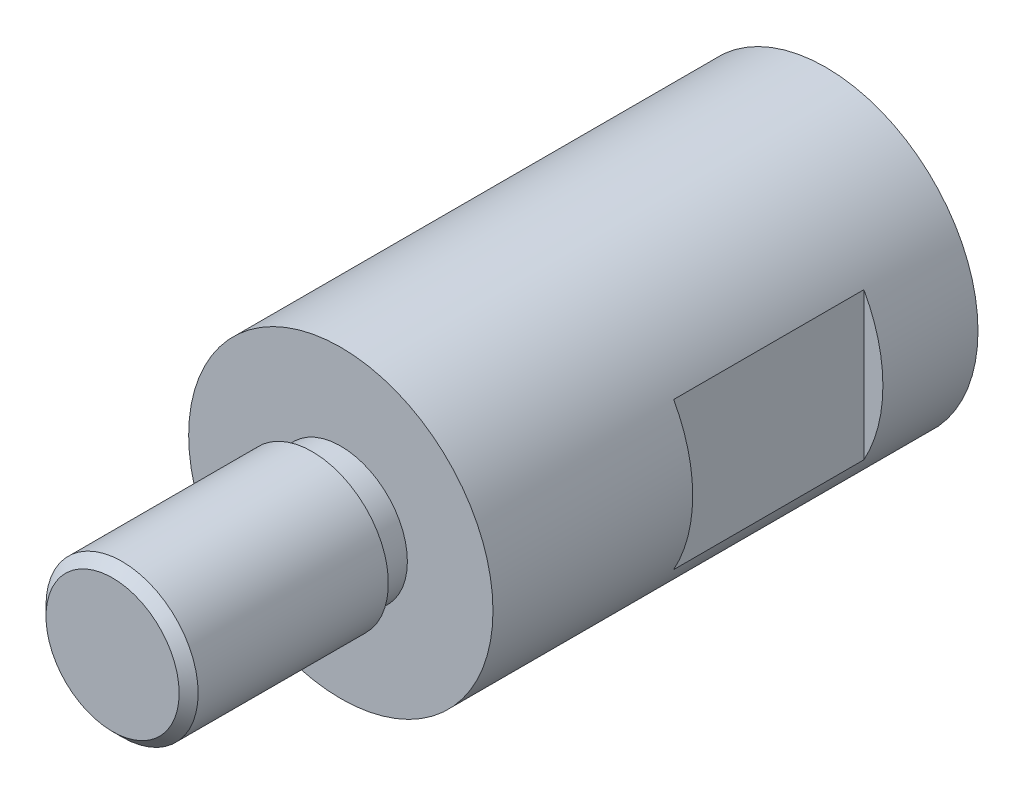
ISO-10303-21;
HEADER;
FILE_DESCRIPTION(('STEP AP214'),'2;1');
FILE_NAME('part.step','',(''),(''),'','','');
FILE_SCHEMA(('AUTOMOTIVE_DESIGN { 1 0 10303 214 1 1 1 1 }'));
ENDSEC;
DATA;
#1=APPLICATION_CONTEXT('core data for automotive mechanical design processes');
#2=APPLICATION_PROTOCOL_DEFINITION('international standard','automotive_design',2000,#1);
#3=PRODUCT_CONTEXT('',#1,'mechanical');
#4=PRODUCT('Part','Part','',(#3));
#5=PRODUCT_RELATED_PRODUCT_CATEGORY('part','',(#4));
#6=PRODUCT_DEFINITION_FORMATION('','',#4);
#7=PRODUCT_DEFINITION_CONTEXT('part definition',#1,'design');
#8=PRODUCT_DEFINITION('design','',#6,#7);
#9=PRODUCT_DEFINITION_SHAPE('','',#8);
#10=(LENGTH_UNIT() NAMED_UNIT(*) SI_UNIT(.MILLI.,.METRE.));
#11=(NAMED_UNIT(*) PLANE_ANGLE_UNIT() SI_UNIT($,.RADIAN.));
#12=(NAMED_UNIT(*) SI_UNIT($,.STERADIAN.) SOLID_ANGLE_UNIT());
#13=UNCERTAINTY_MEASURE_WITH_UNIT(LENGTH_MEASURE(1.E-05),#10,'distance_accuracy_value','');
#14=(GEOMETRIC_REPRESENTATION_CONTEXT(3) GLOBAL_UNCERTAINTY_ASSIGNED_CONTEXT((#13)) GLOBAL_UNIT_ASSIGNED_CONTEXT((#10,
#11,#12)) REPRESENTATION_CONTEXT('',''));
#15=CARTESIAN_POINT('',(0.,0.,0.));
#16=DIRECTION('',(0.,0.,1.));
#17=DIRECTION('',(1.,0.,0.));
#18=AXIS2_PLACEMENT_3D('',#15,#16,#17);
#19=CARTESIAN_POINT('',(0.,0.,25.5));
#20=DIRECTION('',(0.,0.,1.));
#21=DIRECTION('',(1.,0.,0.));
#22=AXIS2_PLACEMENT_3D('',#19,#20,#21);
#23=PLANE('',#22);
#24=CARTESIAN_POINT('',(0.,0.,25.5));
#25=DIRECTION('',(0.,0.,1.));
#26=DIRECTION('',(1.,0.,0.));
#27=AXIS2_PLACEMENT_3D('',#24,#25,#26);
#28=CIRCLE('',#27,3.5);
#29=CARTESIAN_POINT('',(3.5,0.,25.5));
#30=VERTEX_POINT('',#29);
#31=EDGE_CURVE('E185',#30,#30,#28,.T.);
#32=ORIENTED_EDGE('',*,*,#31,.F.);
#33=EDGE_LOOP('',(#32));
#34=FACE_BOUND('',#33,.T.);
#35=CARTESIAN_POINT('',(0.,0.,25.5));
#36=DIRECTION('',(0.,0.,1.));
#37=DIRECTION('',(1.,0.,0.));
#38=AXIS2_PLACEMENT_3D('',#35,#36,#37);
#39=CIRCLE('',#38,8.);
#40=CARTESIAN_POINT('',(8.,0.,25.5));
#41=VERTEX_POINT('',#40);
#42=EDGE_CURVE('E103',#41,#41,#39,.T.);
#43=ORIENTED_EDGE('',*,*,#42,.T.);
#44=EDGE_LOOP('',(#43));
#45=FACE_BOUND('',#44,.T.);
#46=ADVANCED_FACE('F34',(#34,#45),#23,.T.);
#47=CARTESIAN_POINT('',(0.,0.,25.5));
#48=DIRECTION('',(0.,0.,-1.));
#49=DIRECTION('',(-1.,0.,0.));
#50=AXIS2_PLACEMENT_3D('',#47,#48,#49);
#51=CYLINDRICAL_SURFACE('',#50,8.);
#52=CARTESIAN_POINT('',(0.,0.,15.));
#53=DIRECTION('',(0.,0.,1.));
#54=DIRECTION('',(1.,0.,0.));
#55=AXIS2_PLACEMENT_3D('',#52,#53,#54);
#56=CIRCLE('',#55,8.);
#57=CARTESIAN_POINT('',(7.,-3.87298334620741,15.));
#58=VERTEX_POINT('',#57);
#59=CARTESIAN_POINT('',(7.,3.87298334620741,15.));
#60=VERTEX_POINT('',#59);
#61=EDGE_CURVE('E128',#58,#60,#56,.T.);
#62=ORIENTED_EDGE('',*,*,#61,.T.);
#63=DIRECTION('',(0.,0.,-1.));
#64=VECTOR('',#63,1.);
#65=CARTESIAN_POINT('',(7.,3.87298334620741,25.5));
#66=LINE('',#65,#64);
#67=CARTESIAN_POINT('',(7.,3.87298334620742,5.));
#68=VERTEX_POINT('',#67);
#69=EDGE_CURVE('E125',#60,#68,#66,.T.);
#70=ORIENTED_EDGE('',*,*,#69,.T.);
#71=CARTESIAN_POINT('',(0.,0.,4.99999999999999));
#72=DIRECTION('',(0.,0.,-1.));
#73=DIRECTION('',(-1.,0.,0.));
#74=AXIS2_PLACEMENT_3D('',#71,#72,#73);
#75=CIRCLE('',#74,8.);
#76=CARTESIAN_POINT('',(7.,-3.87298334620742,5.));
#77=VERTEX_POINT('',#76);
#78=EDGE_CURVE('E119',#68,#77,#75,.T.);
#79=ORIENTED_EDGE('',*,*,#78,.T.);
#80=DIRECTION('',(0.,0.,-1.));
#81=VECTOR('',#80,1.);
#82=CARTESIAN_POINT('',(7.,-3.87298334620741,25.5));
#83=LINE('',#82,#81);
#84=EDGE_CURVE('E122',#77,#58,#83,.F.);
#85=ORIENTED_EDGE('',*,*,#84,.T.);
#86=EDGE_LOOP('',(#62,#70,#79,#85));
#87=FACE_BOUND('',#86,.T.);
#88=CARTESIAN_POINT('',(0.,0.,5.));
#89=DIRECTION('',(0.,0.,-1.));
#90=DIRECTION('',(-1.,0.,0.));
#91=AXIS2_PLACEMENT_3D('',#88,#89,#90);
#92=CIRCLE('',#91,8.);
#93=CARTESIAN_POINT('',(-7.,-3.87298334620742,5.));
#94=VERTEX_POINT('',#93);
#95=CARTESIAN_POINT('',(-7.,3.87298334620742,5.));
#96=VERTEX_POINT('',#95);
#97=EDGE_CURVE('E117',#94,#96,#92,.T.);
#98=ORIENTED_EDGE('',*,*,#97,.T.);
#99=DIRECTION('',(0.,0.,-1.));
#100=VECTOR('',#99,1.);
#101=CARTESIAN_POINT('',(-7.,3.87298334620742,25.5));
#102=LINE('',#101,#100);
#103=CARTESIAN_POINT('',(-7.,3.87298334620742,15.));
#104=VERTEX_POINT('',#103);
#105=EDGE_CURVE('E111',#96,#104,#102,.F.);
#106=ORIENTED_EDGE('',*,*,#105,.T.);
#107=CARTESIAN_POINT('',(0.,0.,15.));
#108=DIRECTION('',(0.,0.,1.));
#109=DIRECTION('',(1.,0.,0.));
#110=AXIS2_PLACEMENT_3D('',#107,#108,#109);
#111=CIRCLE('',#110,8.);
#112=CARTESIAN_POINT('',(-7.,-3.87298334620742,15.));
#113=VERTEX_POINT('',#112);
#114=EDGE_CURVE('E106',#104,#113,#111,.T.);
#115=ORIENTED_EDGE('',*,*,#114,.T.);
#116=DIRECTION('',(0.,0.,-1.));
#117=VECTOR('',#116,1.);
#118=CARTESIAN_POINT('',(-7.,-3.87298334620742,25.5));
#119=LINE('',#118,#117);
#120=EDGE_CURVE('E114',#113,#94,#119,.T.);
#121=ORIENTED_EDGE('',*,*,#120,.T.);
#122=EDGE_LOOP('',(#98,#106,#115,#121));
#123=FACE_BOUND('',#122,.T.);
#124=ORIENTED_EDGE('',*,*,#42,.F.);
#125=EDGE_LOOP('',(#124));
#126=FACE_BOUND('',#125,.T.);
#127=CARTESIAN_POINT('',(0.,0.,0.));
#128=DIRECTION('',(0.,0.,1.));
#129=DIRECTION('',(1.,0.,0.));
#130=AXIS2_PLACEMENT_3D('',#127,#128,#129);
#131=CIRCLE('',#130,8.);
#132=CARTESIAN_POINT('',(8.,0.,0.));
#133=VERTEX_POINT('',#132);
#134=EDGE_CURVE('E101',#133,#133,#131,.T.);
#135=ORIENTED_EDGE('',*,*,#134,.T.);
#136=EDGE_LOOP('',(#135));
#137=FACE_BOUND('',#136,.T.);
#138=ADVANCED_FACE('F148',(#87,#123,#126,#137),#51,.T.);
#139=CARTESIAN_POINT('',(0.,0.,0.));
#140=DIRECTION('',(0.,0.,1.));
#141=DIRECTION('',(1.,0.,0.));
#142=AXIS2_PLACEMENT_3D('',#139,#140,#141);
#143=PLANE('',#142);
#144=CARTESIAN_POINT('',(0.,0.,0.));
#145=DIRECTION('',(0.,0.,-1.));
#146=DIRECTION('',(-1.,0.,0.));
#147=AXIS2_PLACEMENT_3D('',#144,#145,#146);
#148=CIRCLE('',#147,4.);
#149=CARTESIAN_POINT('',(-4.,0.,0.));
#150=VERTEX_POINT('',#149);
#151=EDGE_CURVE('E174',#150,#150,#148,.T.);
#152=ORIENTED_EDGE('',*,*,#151,.F.);
#153=EDGE_LOOP('',(#152));
#154=FACE_BOUND('',#153,.T.);
#155=ORIENTED_EDGE('',*,*,#134,.F.);
#156=EDGE_LOOP('',(#155));
#157=FACE_BOUND('',#156,.T.);
#158=ADVANCED_FACE('F154',(#154,#157),#143,.F.);
#159=CARTESIAN_POINT('',(-8.,-9.25,5.));
#160=DIRECTION('',(0.,0.,-1.));
#161=DIRECTION('',(-1.,0.,0.));
#162=AXIS2_PLACEMENT_3D('',#159,#160,#161);
#163=PLANE('',#162);
#164=ORIENTED_EDGE('',*,*,#97,.F.);
#165=DIRECTION('',(0.,1.,0.));
#166=VECTOR('',#165,1.);
#167=CARTESIAN_POINT('',(-7.,-9.25,5.));
#168=LINE('',#167,#166);
#169=EDGE_CURVE('E98',#94,#96,#168,.T.);
#170=ORIENTED_EDGE('',*,*,#169,.T.);
#171=EDGE_LOOP('',(#164,#170));
#172=FACE_BOUND('',#171,.T.);
#173=ADVANCED_FACE('F163',(#172),#163,.F.);
#174=CARTESIAN_POINT('',(-7.,-9.25,5.));
#175=DIRECTION('',(1.,0.,0.));
#176=DIRECTION('',(0.,0.,-1.));
#177=AXIS2_PLACEMENT_3D('',#174,#175,#176);
#178=PLANE('',#177);
#179=DIRECTION('',(0.,1.,0.));
#180=VECTOR('',#179,1.);
#181=CARTESIAN_POINT('',(-7.,-9.25,15.));
#182=LINE('',#181,#180);
#183=EDGE_CURVE('E56',#113,#104,#182,.T.);
#184=ORIENTED_EDGE('',*,*,#183,.T.);
#185=ORIENTED_EDGE('',*,*,#105,.F.);
#186=ORIENTED_EDGE('',*,*,#169,.F.);
#187=ORIENTED_EDGE('',*,*,#120,.F.);
#188=EDGE_LOOP('',(#184,#185,#186,#187));
#189=FACE_BOUND('',#188,.T.);
#190=ADVANCED_FACE('F168',(#189),#178,.F.);
#191=CARTESIAN_POINT('',(-8.,-9.25,15.));
#192=DIRECTION('',(0.,0.,1.));
#193=DIRECTION('',(1.,0.,0.));
#194=AXIS2_PLACEMENT_3D('',#191,#192,#193);
#195=PLANE('',#194);
#196=ORIENTED_EDGE('',*,*,#183,.F.);
#197=ORIENTED_EDGE('',*,*,#114,.F.);
#198=EDGE_LOOP('',(#196,#197));
#199=FACE_BOUND('',#198,.T.);
#200=ADVANCED_FACE('F160',(#199),#195,.F.);
#201=CARTESIAN_POINT('',(8.,-9.25,15.));
#202=DIRECTION('',(0.,0.,1.));
#203=DIRECTION('',(1.,0.,0.));
#204=AXIS2_PLACEMENT_3D('',#201,#202,#203);
#205=PLANE('',#204);
#206=ORIENTED_EDGE('',*,*,#61,.F.);
#207=DIRECTION('',(0.,1.,0.));
#208=VECTOR('',#207,1.);
#209=CARTESIAN_POINT('',(7.,-9.25,15.));
#210=LINE('',#209,#208);
#211=EDGE_CURVE('E89',#58,#60,#210,.T.);
#212=ORIENTED_EDGE('',*,*,#211,.T.);
#213=EDGE_LOOP('',(#206,#212));
#214=FACE_BOUND('',#213,.T.);
#215=ADVANCED_FACE('F212',(#214),#205,.F.);
#216=CARTESIAN_POINT('',(7.,-9.25,5.));
#217=DIRECTION('',(-1.,0.,0.));
#218=DIRECTION('',(0.,0.,1.));
#219=AXIS2_PLACEMENT_3D('',#216,#217,#218);
#220=PLANE('',#219);
#221=ORIENTED_EDGE('',*,*,#211,.F.);
#222=ORIENTED_EDGE('',*,*,#84,.F.);
#223=DIRECTION('',(0.,1.,0.));
#224=VECTOR('',#223,1.);
#225=CARTESIAN_POINT('',(7.,-9.25,5.));
#226=LINE('',#225,#224);
#227=EDGE_CURVE('E49',#77,#68,#226,.T.);
#228=ORIENTED_EDGE('',*,*,#227,.T.);
#229=ORIENTED_EDGE('',*,*,#69,.F.);
#230=EDGE_LOOP('',(#221,#222,#228,#229));
#231=FACE_BOUND('',#230,.T.);
#232=ADVANCED_FACE('F215',(#231),#220,.F.);
#233=CARTESIAN_POINT('',(8.,-9.25,5.));
#234=DIRECTION('',(0.,0.,-1.));
#235=DIRECTION('',(-1.,0.,0.));
#236=AXIS2_PLACEMENT_3D('',#233,#234,#235);
#237=PLANE('',#236);
#238=ORIENTED_EDGE('',*,*,#227,.F.);
#239=ORIENTED_EDGE('',*,*,#78,.F.);
#240=EDGE_LOOP('',(#238,#239));
#241=FACE_BOUND('',#240,.T.);
#242=ADVANCED_FACE('F81',(#241),#237,.F.);
#243=CARTESIAN_POINT('',(0.,0.,19.75));
#244=DIRECTION('',(0.,0.,-1.));
#245=DIRECTION('',(-1.,0.,0.));
#246=AXIS2_PLACEMENT_3D('',#243,#244,#245);
#247=CONICAL_SURFACE('',#246,3.4,1.02974425867665);
#248=CARTESIAN_POINT('',(0.,0.,21.7929261046937));
#249=VERTEX_POINT('',#248);
#250=VERTEX_LOOP('',#249);
#251=FACE_BOUND('',#250,.T.);
#252=CARTESIAN_POINT('',(0.,0.,19.75));
#253=DIRECTION('',(0.,0.,-1.));
#254=DIRECTION('',(-1.,0.,0.));
#255=AXIS2_PLACEMENT_3D('',#252,#253,#254);
#256=CIRCLE('',#255,3.4);
#257=CARTESIAN_POINT('',(-3.4,0.,19.75));
#258=VERTEX_POINT('',#257);
#259=EDGE_CURVE('E85',#258,#258,#256,.T.);
#260=ORIENTED_EDGE('',*,*,#259,.T.);
#261=EDGE_LOOP('',(#260));
#262=FACE_BOUND('',#261,.T.);
#263=ADVANCED_FACE('F77',(#251,#262),#247,.F.);
#264=CARTESIAN_POINT('',(0.,0.,0.));
#265=DIRECTION('',(0.,0.,-1.));
#266=DIRECTION('',(-1.,0.,0.));
#267=AXIS2_PLACEMENT_3D('',#264,#265,#266);
#268=CYLINDRICAL_SURFACE('',#267,3.4);
#269=ORIENTED_EDGE('',*,*,#259,.F.);
#270=EDGE_LOOP('',(#269));
#271=FACE_BOUND('',#270,.T.);
#272=CARTESIAN_POINT('',(0.,0.,16.));
#273=DIRECTION('',(0.,0.,-1.));
#274=DIRECTION('',(-1.,0.,0.));
#275=AXIS2_PLACEMENT_3D('',#272,#273,#274);
#276=CIRCLE('',#275,3.4);
#277=CARTESIAN_POINT('',(-3.4,0.,16.));
#278=VERTEX_POINT('',#277);
#279=EDGE_CURVE('E87',#278,#278,#276,.T.);
#280=ORIENTED_EDGE('',*,*,#279,.T.);
#281=EDGE_LOOP('',(#280));
#282=FACE_BOUND('',#281,.T.);
#283=ADVANCED_FACE('F80',(#271,#282),#268,.F.);
#284=CARTESIAN_POINT('',(3.4,0.,16.));
#285=DIRECTION('',(0.,0.,1.));
#286=DIRECTION('',(1.,0.,0.));
#287=AXIS2_PLACEMENT_3D('',#284,#285,#286);
#288=PLANE('',#287);
#289=ORIENTED_EDGE('',*,*,#279,.F.);
#290=EDGE_LOOP('',(#289));
#291=FACE_BOUND('',#290,.T.);
#292=CARTESIAN_POINT('',(0.,0.,16.));
#293=DIRECTION('',(0.,0.,-1.));
#294=DIRECTION('',(-1.,0.,0.));
#295=AXIS2_PLACEMENT_3D('',#292,#293,#294);
#296=CIRCLE('',#295,4.);
#297=CARTESIAN_POINT('',(-4.,0.,16.));
#298=VERTEX_POINT('',#297);
#299=EDGE_CURVE('E92',#298,#298,#296,.T.);
#300=ORIENTED_EDGE('',*,*,#299,.T.);
#301=EDGE_LOOP('',(#300));
#302=FACE_BOUND('',#301,.T.);
#303=ADVANCED_FACE('F203',(#291,#302),#288,.F.);
#304=CARTESIAN_POINT('',(0.,0.,0.));
#305=DIRECTION('',(0.,0.,-1.));
#306=DIRECTION('',(-1.,0.,0.));
#307=AXIS2_PLACEMENT_3D('',#304,#305,#306);
#308=CYLINDRICAL_SURFACE('',#307,4.);
#309=ORIENTED_EDGE('',*,*,#299,.F.);
#310=EDGE_LOOP('',(#309));
#311=FACE_BOUND('',#310,.T.);
#312=ORIENTED_EDGE('',*,*,#151,.T.);
#313=EDGE_LOOP('',(#312));
#314=FACE_BOUND('',#313,.T.);
#315=ADVANCED_FACE('F196',(#311,#314),#308,.F.);
#316=CARTESIAN_POINT('',(0.,3.5,27.));
#317=DIRECTION('',(0.,0.,-1.));
#318=DIRECTION('',(-1.,0.,0.));
#319=AXIS2_PLACEMENT_3D('',#316,#317,#318);
#320=PLANE('',#319);
#321=CARTESIAN_POINT('',(0.,0.,27.));
#322=DIRECTION('',(0.,0.,1.));
#323=DIRECTION('',(1.,0.,0.));
#324=AXIS2_PLACEMENT_3D('',#321,#322,#323);
#325=CIRCLE('',#324,3.5);
#326=CARTESIAN_POINT('',(3.5,0.,27.));
#327=VERTEX_POINT('',#326);
#328=EDGE_CURVE('E181',#327,#327,#325,.T.);
#329=ORIENTED_EDGE('',*,*,#328,.T.);
#330=EDGE_LOOP('',(#329));
#331=FACE_BOUND('',#330,.T.);
#332=CARTESIAN_POINT('',(0.,0.,27.));
#333=DIRECTION('',(0.,0.,-1.));
#334=DIRECTION('',(-1.,0.,0.));
#335=AXIS2_PLACEMENT_3D('',#332,#333,#334);
#336=CIRCLE('',#335,4.);
#337=CARTESIAN_POINT('',(-4.,0.,27.));
#338=VERTEX_POINT('',#337);
#339=EDGE_CURVE('E38',#338,#338,#336,.T.);
#340=ORIENTED_EDGE('',*,*,#339,.T.);
#341=EDGE_LOOP('',(#340));
#342=FACE_BOUND('',#341,.T.);
#343=ADVANCED_FACE('F190',(#331,#342),#320,.T.);
#344=CARTESIAN_POINT('',(0.,0.,15.));
#345=DIRECTION('',(0.,0.,1.));
#346=DIRECTION('',(1.,0.,0.));
#347=AXIS2_PLACEMENT_3D('',#344,#345,#346);
#348=CYLINDRICAL_SURFACE('',#347,3.5);
#349=ORIENTED_EDGE('',*,*,#31,.T.);
#350=EDGE_LOOP('',(#349));
#351=FACE_BOUND('',#350,.T.);
#352=ORIENTED_EDGE('',*,*,#328,.F.);
#353=EDGE_LOOP('',(#352));
#354=FACE_BOUND('',#353,.T.);
#355=ADVANCED_FACE('F144',(#351,#354),#348,.T.);
#356=CARTESIAN_POINT('',(0.,0.,37.5));
#357=DIRECTION('',(0.,0.,1.));
#358=DIRECTION('',(1.,0.,0.));
#359=AXIS2_PLACEMENT_3D('',#356,#357,#358);
#360=PLANE('',#359);
#361=CARTESIAN_POINT('',(0.,0.,37.5));
#362=DIRECTION('',(0.,0.,1.));
#363=DIRECTION('',(1.,0.,0.));
#364=AXIS2_PLACEMENT_3D('',#361,#362,#363);
#365=CIRCLE('',#364,3.5);
#366=CARTESIAN_POINT('',(3.5,0.,37.5));
#367=VERTEX_POINT('',#366);
#368=EDGE_CURVE('E43',#367,#367,#365,.T.);
#369=ORIENTED_EDGE('',*,*,#368,.T.);
#370=EDGE_LOOP('',(#369));
#371=FACE_BOUND('',#370,.T.);
#372=ADVANCED_FACE('F133',(#371),#360,.T.);
#373=CARTESIAN_POINT('',(0.,0.,37.5));
#374=DIRECTION('',(0.,0.,-1.));
#375=DIRECTION('',(-1.,0.,0.));
#376=AXIS2_PLACEMENT_3D('',#373,#374,#375);
#377=CONICAL_SURFACE('',#376,3.5,0.785398163397452);
#378=CARTESIAN_POINT('',(0.,0.,37.));
#379=DIRECTION('',(0.,0.,1.));
#380=DIRECTION('',(1.,0.,0.));
#381=AXIS2_PLACEMENT_3D('',#378,#379,#380);
#382=CIRCLE('',#381,4.);
#383=CARTESIAN_POINT('',(4.,0.,37.));
#384=VERTEX_POINT('',#383);
#385=EDGE_CURVE('E11',#384,#384,#382,.F.);
#386=ORIENTED_EDGE('',*,*,#385,.F.);
#387=EDGE_LOOP('',(#386));
#388=FACE_BOUND('',#387,.T.);
#389=ORIENTED_EDGE('',*,*,#368,.F.);
#390=EDGE_LOOP('',(#389));
#391=FACE_BOUND('',#390,.T.);
#392=ADVANCED_FACE('F36',(#388,#391),#377,.T.);
#393=CARTESIAN_POINT('',(0.,0.,37.5));
#394=DIRECTION('',(0.,0.,-1.));
#395=DIRECTION('',(-1.,0.,0.));
#396=AXIS2_PLACEMENT_3D('',#393,#394,#395);
#397=CYLINDRICAL_SURFACE('',#396,4.);
#398=ORIENTED_EDGE('',*,*,#385,.T.);
#399=EDGE_LOOP('',(#398));
#400=FACE_BOUND('',#399,.T.);
#401=ORIENTED_EDGE('',*,*,#339,.F.);
#402=EDGE_LOOP('',(#401));
#403=FACE_BOUND('',#402,.T.);
#404=ADVANCED_FACE('F136',(#400,#403),#397,.T.);
#405=CLOSED_SHELL('',(#46,#138,#158,#173,#190,#200,#215,#232,#242,#263,#283,#303,#315,#343,#355,
#372,#392,#404));
#406=MANIFOLD_SOLID_BREP('B2',#405);
#407=ADVANCED_BREP_SHAPE_REPRESENTATION('',(#18,#406),#14);
#408=SHAPE_DEFINITION_REPRESENTATION(#9,#407);
ENDSEC;
END-ISO-10303-21;
